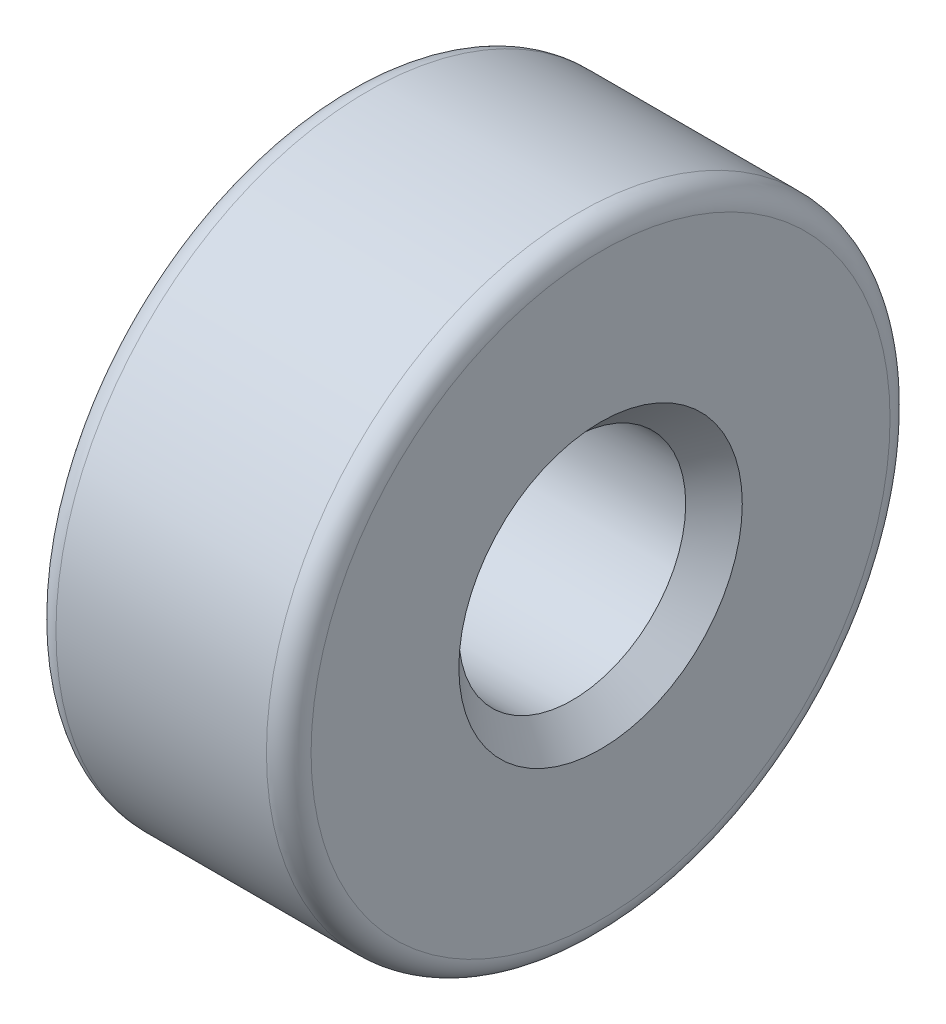
ISO-10303-21;
HEADER;
FILE_DESCRIPTION(('STEP AP214'),'2;1');
FILE_NAME('part.step','',(''),(''),'','','');
FILE_SCHEMA(('AUTOMOTIVE_DESIGN { 1 0 10303 214 1 1 1 1 }'));
ENDSEC;
DATA;
#1=APPLICATION_CONTEXT('core data for automotive mechanical design processes');
#2=APPLICATION_PROTOCOL_DEFINITION('international standard','automotive_design',2000,#1);
#3=PRODUCT_CONTEXT('',#1,'mechanical');
#4=PRODUCT('Part','Part','',(#3));
#5=PRODUCT_RELATED_PRODUCT_CATEGORY('part','',(#4));
#6=PRODUCT_DEFINITION_FORMATION('','',#4);
#7=PRODUCT_DEFINITION_CONTEXT('part definition',#1,'design');
#8=PRODUCT_DEFINITION('design','',#6,#7);
#9=PRODUCT_DEFINITION_SHAPE('','',#8);
#10=(LENGTH_UNIT() NAMED_UNIT(*) SI_UNIT(.MILLI.,.METRE.));
#11=(NAMED_UNIT(*) PLANE_ANGLE_UNIT() SI_UNIT($,.RADIAN.));
#12=(NAMED_UNIT(*) SI_UNIT($,.STERADIAN.) SOLID_ANGLE_UNIT());
#13=UNCERTAINTY_MEASURE_WITH_UNIT(LENGTH_MEASURE(1.E-05),#10,'distance_accuracy_value','');
#14=(GEOMETRIC_REPRESENTATION_CONTEXT(3) GLOBAL_UNCERTAINTY_ASSIGNED_CONTEXT((#13)) GLOBAL_UNIT_ASSIGNED_CONTEXT((#10,
#11,#12)) REPRESENTATION_CONTEXT('',''));
#15=CARTESIAN_POINT('',(0.,0.,0.));
#16=DIRECTION('',(0.,0.,1.));
#17=DIRECTION('',(1.,0.,0.));
#18=AXIS2_PLACEMENT_3D('',#15,#16,#17);
#19=CARTESIAN_POINT('',(0.,63.5000000000001,0.));
#20=DIRECTION('',(1.,0.,0.));
#21=DIRECTION('',(0.,0.,-1.));
#22=AXIS2_PLACEMENT_3D('',#19,#20,#21);
#23=PLANE('',#22);
#24=CARTESIAN_POINT('',(0.,0.,0.));
#25=DIRECTION('',(1.,0.,0.));
#26=DIRECTION('',(0.,0.,-1.));
#27=AXIS2_PLACEMENT_3D('',#24,#25,#26);
#28=CIRCLE('',#27,129.7);
#29=CARTESIAN_POINT('',(0.,0.,-129.7));
#30=VERTEX_POINT('',#29);
#31=EDGE_CURVE('E10',#30,#30,#28,.F.);
#32=ORIENTED_EDGE('',*,*,#31,.T.);
#33=EDGE_LOOP('',(#32));
#34=FACE_BOUND('',#33,.T.);
#35=CARTESIAN_POINT('',(0.,0.,0.));
#36=DIRECTION('',(-1.,0.,0.));
#37=DIRECTION('',(0.,0.,1.));
#38=AXIS2_PLACEMENT_3D('',#35,#36,#37);
#39=CIRCLE('',#38,63.5000000000001);
#40=CARTESIAN_POINT('',(0.,0.,63.5000000000001));
#41=VERTEX_POINT('',#40);
#42=EDGE_CURVE('E60',#41,#41,#39,.T.);
#43=ORIENTED_EDGE('',*,*,#42,.F.);
#44=EDGE_LOOP('',(#43));
#45=FACE_BOUND('',#44,.T.);
#46=ADVANCED_FACE('F31',(#34,#45),#23,.F.);
#47=CARTESIAN_POINT('',(0.,0.,0.));
#48=DIRECTION('',(-1.,0.,0.));
#49=DIRECTION('',(0.,0.,1.));
#50=AXIS2_PLACEMENT_3D('',#47,#48,#49);
#51=CYLINDRICAL_SURFACE('',#50,139.7);
#52=CARTESIAN_POINT('',(104.3,0.,0.));
#53=DIRECTION('',(-1.,0.,0.));
#54=DIRECTION('',(0.,0.,1.));
#55=AXIS2_PLACEMENT_3D('',#52,#53,#54);
#56=CIRCLE('',#55,139.7);
#57=CARTESIAN_POINT('',(104.3,0.,139.7));
#58=VERTEX_POINT('',#57);
#59=EDGE_CURVE('E42',#58,#58,#56,.T.);
#60=ORIENTED_EDGE('',*,*,#59,.T.);
#61=EDGE_LOOP('',(#60));
#62=FACE_BOUND('',#61,.T.);
#63=CARTESIAN_POINT('',(9.99999999999999,0.,0.));
#64=DIRECTION('',(1.,0.,0.));
#65=DIRECTION('',(0.,0.,-1.));
#66=AXIS2_PLACEMENT_3D('',#63,#64,#65);
#67=CIRCLE('',#66,139.7);
#68=CARTESIAN_POINT('',(9.99999999999999,0.,-139.7));
#69=VERTEX_POINT('',#68);
#70=EDGE_CURVE('E46',#69,#69,#67,.T.);
#71=ORIENTED_EDGE('',*,*,#70,.T.);
#72=EDGE_LOOP('',(#71));
#73=FACE_BOUND('',#72,.T.);
#74=ADVANCED_FACE('F67',(#62,#73),#51,.T.);
#75=CARTESIAN_POINT('',(114.3,139.7,0.));
#76=DIRECTION('',(-1.,0.,0.));
#77=DIRECTION('',(0.,0.,1.));
#78=AXIS2_PLACEMENT_3D('',#75,#76,#77);
#79=PLANE('',#78);
#80=CARTESIAN_POINT('',(114.3,0.,0.));
#81=DIRECTION('',(-1.,0.,0.));
#82=DIRECTION('',(0.,0.,1.));
#83=AXIS2_PLACEMENT_3D('',#80,#81,#82);
#84=CIRCLE('',#83,129.7);
#85=CARTESIAN_POINT('',(114.3,0.,129.7));
#86=VERTEX_POINT('',#85);
#87=EDGE_CURVE('E38',#86,#86,#84,.F.);
#88=ORIENTED_EDGE('',*,*,#87,.T.);
#89=EDGE_LOOP('',(#88));
#90=FACE_BOUND('',#89,.T.);
#91=CARTESIAN_POINT('',(114.3,0.,0.));
#92=DIRECTION('',(-1.,0.,0.));
#93=DIRECTION('',(0.,0.,1.));
#94=AXIS2_PLACEMENT_3D('',#91,#92,#93);
#95=CIRCLE('',#94,63.5);
#96=CARTESIAN_POINT('',(114.3,0.,63.5));
#97=VERTEX_POINT('',#96);
#98=EDGE_CURVE('E51',#97,#97,#95,.T.);
#99=ORIENTED_EDGE('',*,*,#98,.T.);
#100=EDGE_LOOP('',(#99));
#101=FACE_BOUND('',#100,.T.);
#102=ADVANCED_FACE('F72',(#90,#101),#79,.F.);
#103=CARTESIAN_POINT('',(101.628646481137,0.,0.));
#104=DIRECTION('',(1.,0.,0.));
#105=DIRECTION('',(0.,0.,-1.));
#106=AXIS2_PLACEMENT_3D('',#103,#104,#105);
#107=CONICAL_SURFACE('',#106,50.8286464811371,0.785398163397449);
#108=ORIENTED_EDGE('',*,*,#98,.F.);
#109=EDGE_LOOP('',(#108));
#110=FACE_BOUND('',#109,.T.);
#111=CARTESIAN_POINT('',(101.628646481137,0.,0.));
#112=DIRECTION('',(-1.,0.,0.));
#113=DIRECTION('',(0.,0.,1.));
#114=AXIS2_PLACEMENT_3D('',#111,#112,#113);
#115=CIRCLE('',#114,50.8286464811371);
#116=CARTESIAN_POINT('',(101.628646481137,0.,50.8286464811371));
#117=VERTEX_POINT('',#116);
#118=EDGE_CURVE('E54',#117,#117,#115,.T.);
#119=ORIENTED_EDGE('',*,*,#118,.T.);
#120=EDGE_LOOP('',(#119));
#121=FACE_BOUND('',#120,.T.);
#122=ADVANCED_FACE('F95',(#110,#121),#107,.F.);
#123=CARTESIAN_POINT('',(0.,0.,0.));
#124=DIRECTION('',(-1.,0.,0.));
#125=DIRECTION('',(0.,0.,1.));
#126=AXIS2_PLACEMENT_3D('',#123,#124,#125);
#127=CYLINDRICAL_SURFACE('',#126,50.8286464811372);
#128=ORIENTED_EDGE('',*,*,#118,.F.);
#129=EDGE_LOOP('',(#128));
#130=FACE_BOUND('',#129,.T.);
#131=CARTESIAN_POINT('',(12.6713535188629,0.,0.));
#132=DIRECTION('',(-1.,0.,0.));
#133=DIRECTION('',(0.,0.,1.));
#134=AXIS2_PLACEMENT_3D('',#131,#132,#133);
#135=CIRCLE('',#134,50.8286464811372);
#136=CARTESIAN_POINT('',(12.6713535188629,0.,50.8286464811372));
#137=VERTEX_POINT('',#136);
#138=EDGE_CURVE('E57',#137,#137,#135,.T.);
#139=ORIENTED_EDGE('',*,*,#138,.T.);
#140=EDGE_LOOP('',(#139));
#141=FACE_BOUND('',#140,.T.);
#142=ADVANCED_FACE('F84',(#130,#141),#127,.F.);
#143=CARTESIAN_POINT('',(0.,0.,0.));
#144=DIRECTION('',(-1.,0.,0.));
#145=DIRECTION('',(0.,0.,1.));
#146=AXIS2_PLACEMENT_3D('',#143,#144,#145);
#147=CONICAL_SURFACE('',#146,63.5000000000001,0.785398163397448);
#148=ORIENTED_EDGE('',*,*,#138,.F.);
#149=EDGE_LOOP('',(#148));
#150=FACE_BOUND('',#149,.T.);
#151=ORIENTED_EDGE('',*,*,#42,.T.);
#152=EDGE_LOOP('',(#151));
#153=FACE_BOUND('',#152,.T.);
#154=ADVANCED_FACE('F64',(#150,#153),#147,.F.);
#155=CARTESIAN_POINT('',(104.3,0.,0.));
#156=DIRECTION('',(-1.,0.,0.));
#157=DIRECTION('',(0.,0.,1.));
#158=AXIS2_PLACEMENT_3D('',#155,#156,#157);
#159=TOROIDAL_SURFACE('',#158,129.7,10.);
#160=ORIENTED_EDGE('',*,*,#87,.F.);
#161=EDGE_LOOP('',(#160));
#162=FACE_BOUND('',#161,.T.);
#163=ORIENTED_EDGE('',*,*,#59,.F.);
#164=EDGE_LOOP('',(#163));
#165=FACE_BOUND('',#164,.T.);
#166=ADVANCED_FACE('F76',(#162,#165),#159,.T.);
#167=CARTESIAN_POINT('',(9.99999999999999,0.,0.));
#168=DIRECTION('',(1.,0.,0.));
#169=DIRECTION('',(0.,0.,-1.));
#170=AXIS2_PLACEMENT_3D('',#167,#168,#169);
#171=TOROIDAL_SURFACE('',#170,129.7,10.);
#172=ORIENTED_EDGE('',*,*,#70,.F.);
#173=EDGE_LOOP('',(#172));
#174=FACE_BOUND('',#173,.T.);
#175=ORIENTED_EDGE('',*,*,#31,.F.);
#176=EDGE_LOOP('',(#175));
#177=FACE_BOUND('',#176,.T.);
#178=ADVANCED_FACE('F33',(#174,#177),#171,.T.);
#179=CLOSED_SHELL('',(#46,#74,#102,#122,#142,#154,#166,#178));
#180=MANIFOLD_SOLID_BREP('B2',#179);
#181=ADVANCED_BREP_SHAPE_REPRESENTATION('',(#18,#180),#14);
#182=SHAPE_DEFINITION_REPRESENTATION(#9,#181);
ENDSEC;
END-ISO-10303-21;
